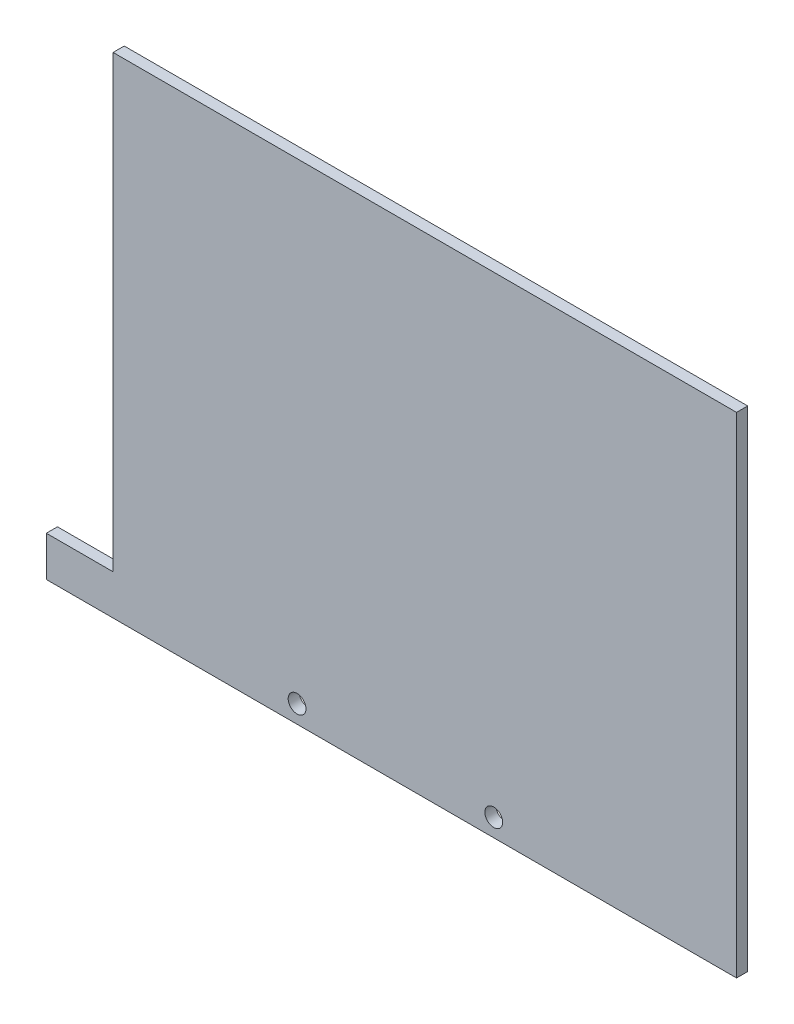
ISO-10303-21;
HEADER;
FILE_DESCRIPTION(('STEP AP214'),'2;1');
FILE_NAME('part.step','',(''),(''),'','','');
FILE_SCHEMA(('AUTOMOTIVE_DESIGN { 1 0 10303 214 1 1 1 1 }'));
ENDSEC;
DATA;
#1=APPLICATION_CONTEXT('core data for automotive mechanical design processes');
#2=APPLICATION_PROTOCOL_DEFINITION('international standard','automotive_design',2000,#1);
#3=PRODUCT_CONTEXT('',#1,'mechanical');
#4=PRODUCT('Part','Part','',(#3));
#5=PRODUCT_RELATED_PRODUCT_CATEGORY('part','',(#4));
#6=PRODUCT_DEFINITION_FORMATION('','',#4);
#7=PRODUCT_DEFINITION_CONTEXT('part definition',#1,'design');
#8=PRODUCT_DEFINITION('design','',#6,#7);
#9=PRODUCT_DEFINITION_SHAPE('','',#8);
#10=(LENGTH_UNIT() NAMED_UNIT(*) SI_UNIT(.MILLI.,.METRE.));
#11=(NAMED_UNIT(*) PLANE_ANGLE_UNIT() SI_UNIT($,.RADIAN.));
#12=(NAMED_UNIT(*) SI_UNIT($,.STERADIAN.) SOLID_ANGLE_UNIT());
#13=UNCERTAINTY_MEASURE_WITH_UNIT(LENGTH_MEASURE(1.E-05),#10,'distance_accuracy_value','');
#14=(GEOMETRIC_REPRESENTATION_CONTEXT(3) GLOBAL_UNCERTAINTY_ASSIGNED_CONTEXT((#13)) GLOBAL_UNIT_ASSIGNED_CONTEXT((#10,
#11,#12)) REPRESENTATION_CONTEXT('',''));
#15=CARTESIAN_POINT('',(0.,0.,0.));
#16=DIRECTION('',(0.,0.,1.));
#17=DIRECTION('',(1.,0.,0.));
#18=AXIS2_PLACEMENT_3D('',#15,#16,#17);
#19=CARTESIAN_POINT('',(0.,-110.,5.));
#20=DIRECTION('',(0.,1.,0.));
#21=DIRECTION('',(-1.,0.,0.));
#22=AXIS2_PLACEMENT_3D('',#19,#20,#21);
#23=PLANE('',#22);
#24=DIRECTION('',(1.,0.,0.));
#25=VECTOR('',#24,1.);
#26=CARTESIAN_POINT('',(0.,-110.,0.));
#27=LINE('',#26,#25);
#28=CARTESIAN_POINT('',(-170.,-110.,0.));
#29=VERTEX_POINT('',#28);
#30=CARTESIAN_POINT('',(140.,-110.,0.));
#31=VERTEX_POINT('',#30);
#32=EDGE_CURVE('E122',#29,#31,#27,.T.);
#33=ORIENTED_EDGE('',*,*,#32,.T.);
#34=DIRECTION('',(0.,0.,-1.));
#35=VECTOR('',#34,1.);
#36=CARTESIAN_POINT('',(140.,-110.,5.));
#37=LINE('',#36,#35);
#38=CARTESIAN_POINT('',(140.,-110.,5.));
#39=VERTEX_POINT('',#38);
#40=EDGE_CURVE('E11',#39,#31,#37,.T.);
#41=ORIENTED_EDGE('',*,*,#40,.F.);
#42=DIRECTION('',(1.,0.,0.));
#43=VECTOR('',#42,1.);
#44=CARTESIAN_POINT('',(0.,-110.,5.));
#45=LINE('',#44,#43);
#46=CARTESIAN_POINT('',(-170.,-110.,5.));
#47=VERTEX_POINT('',#46);
#48=EDGE_CURVE('E136',#47,#39,#45,.T.);
#49=ORIENTED_EDGE('',*,*,#48,.F.);
#50=DIRECTION('',(0.,0.,-1.));
#51=VECTOR('',#50,1.);
#52=CARTESIAN_POINT('',(-170.,-110.,5.));
#53=LINE('',#52,#51);
#54=EDGE_CURVE('E53',#47,#29,#53,.T.);
#55=ORIENTED_EDGE('',*,*,#54,.T.);
#56=EDGE_LOOP('',(#33,#41,#49,#55));
#57=FACE_BOUND('',#56,.T.);
#58=ADVANCED_FACE('F35',(#57),#23,.F.);
#59=CARTESIAN_POINT('',(140.,0.,5.));
#60=DIRECTION('',(-1.,0.,0.));
#61=DIRECTION('',(0.,-1.,0.));
#62=AXIS2_PLACEMENT_3D('',#59,#60,#61);
#63=PLANE('',#62);
#64=DIRECTION('',(0.,1.,0.));
#65=VECTOR('',#64,1.);
#66=CARTESIAN_POINT('',(140.,0.,0.));
#67=LINE('',#66,#65);
#68=CARTESIAN_POINT('',(140.,110.,0.));
#69=VERTEX_POINT('',#68);
#70=EDGE_CURVE('E124',#31,#69,#67,.T.);
#71=ORIENTED_EDGE('',*,*,#70,.T.);
#72=DIRECTION('',(0.,0.,-1.));
#73=VECTOR('',#72,1.);
#74=CARTESIAN_POINT('',(140.,110.,5.));
#75=LINE('',#74,#73);
#76=CARTESIAN_POINT('',(140.,110.,5.));
#77=VERTEX_POINT('',#76);
#78=EDGE_CURVE('E44',#77,#69,#75,.T.);
#79=ORIENTED_EDGE('',*,*,#78,.F.);
#80=DIRECTION('',(0.,1.,0.));
#81=VECTOR('',#80,1.);
#82=CARTESIAN_POINT('',(140.,0.,5.));
#83=LINE('',#82,#81);
#84=EDGE_CURVE('E86',#39,#77,#83,.T.);
#85=ORIENTED_EDGE('',*,*,#84,.F.);
#86=ORIENTED_EDGE('',*,*,#40,.T.);
#87=EDGE_LOOP('',(#71,#79,#85,#86));
#88=FACE_BOUND('',#87,.T.);
#89=ADVANCED_FACE('F155',(#88),#63,.F.);
#90=CARTESIAN_POINT('',(0.,110.,5.));
#91=DIRECTION('',(0.,1.,0.));
#92=DIRECTION('',(-1.,0.,0.));
#93=AXIS2_PLACEMENT_3D('',#90,#91,#92);
#94=PLANE('',#93);
#95=DIRECTION('',(1.,0.,0.));
#96=VECTOR('',#95,1.);
#97=CARTESIAN_POINT('',(0.,110.,0.));
#98=LINE('',#97,#96);
#99=CARTESIAN_POINT('',(-140.,110.,0.));
#100=VERTEX_POINT('',#99);
#101=EDGE_CURVE('E127',#100,#69,#98,.T.);
#102=ORIENTED_EDGE('',*,*,#101,.F.);
#103=DIRECTION('',(0.,0.,-1.));
#104=VECTOR('',#103,1.);
#105=CARTESIAN_POINT('',(-140.,110.,5.));
#106=LINE('',#105,#104);
#107=CARTESIAN_POINT('',(-140.,110.,5.));
#108=VERTEX_POINT('',#107);
#109=EDGE_CURVE('E105',#108,#100,#106,.T.);
#110=ORIENTED_EDGE('',*,*,#109,.F.);
#111=DIRECTION('',(1.,0.,0.));
#112=VECTOR('',#111,1.);
#113=CARTESIAN_POINT('',(0.,110.,5.));
#114=LINE('',#113,#112);
#115=EDGE_CURVE('E116',#108,#77,#114,.T.);
#116=ORIENTED_EDGE('',*,*,#115,.T.);
#117=ORIENTED_EDGE('',*,*,#78,.T.);
#118=EDGE_LOOP('',(#102,#110,#116,#117));
#119=FACE_BOUND('',#118,.T.);
#120=ADVANCED_FACE('F158',(#119),#94,.T.);
#121=CARTESIAN_POINT('',(-140.,0.,5.));
#122=DIRECTION('',(-1.,0.,0.));
#123=DIRECTION('',(0.,-1.,0.));
#124=AXIS2_PLACEMENT_3D('',#121,#122,#123);
#125=PLANE('',#124);
#126=DIRECTION('',(0.,1.,0.));
#127=VECTOR('',#126,1.);
#128=CARTESIAN_POINT('',(-140.,0.,0.));
#129=LINE('',#128,#127);
#130=CARTESIAN_POINT('',(-140.,-92.0000000000001,0.));
#131=VERTEX_POINT('',#130);
#132=EDGE_CURVE('E102',#131,#100,#129,.T.);
#133=ORIENTED_EDGE('',*,*,#132,.F.);
#134=DIRECTION('',(0.,0.,-1.));
#135=VECTOR('',#134,1.);
#136=CARTESIAN_POINT('',(-140.,-92.0000000000001,5.));
#137=LINE('',#136,#135);
#138=CARTESIAN_POINT('',(-140.,-92.0000000000001,5.));
#139=VERTEX_POINT('',#138);
#140=EDGE_CURVE('E96',#139,#131,#137,.T.);
#141=ORIENTED_EDGE('',*,*,#140,.F.);
#142=DIRECTION('',(0.,1.,0.));
#143=VECTOR('',#142,1.);
#144=CARTESIAN_POINT('',(-140.,0.,5.));
#145=LINE('',#144,#143);
#146=EDGE_CURVE('E100',#139,#108,#145,.T.);
#147=ORIENTED_EDGE('',*,*,#146,.T.);
#148=ORIENTED_EDGE('',*,*,#109,.T.);
#149=EDGE_LOOP('',(#133,#141,#147,#148));
#150=FACE_BOUND('',#149,.T.);
#151=ADVANCED_FACE('F98',(#150),#125,.T.);
#152=CARTESIAN_POINT('',(0.,-92.0000000000001,5.));
#153=DIRECTION('',(0.,-1.,0.));
#154=DIRECTION('',(0.,0.,-1.));
#155=AXIS2_PLACEMENT_3D('',#152,#153,#154);
#156=PLANE('',#155);
#157=DIRECTION('',(-1.,0.,0.));
#158=VECTOR('',#157,1.);
#159=CARTESIAN_POINT('',(0.,-92.0000000000001,0.));
#160=LINE('',#159,#158);
#161=CARTESIAN_POINT('',(-170.,-92.0000000000001,0.));
#162=VERTEX_POINT('',#161);
#163=EDGE_CURVE('E131',#131,#162,#160,.T.);
#164=ORIENTED_EDGE('',*,*,#163,.T.);
#165=DIRECTION('',(0.,0.,-1.));
#166=VECTOR('',#165,1.);
#167=CARTESIAN_POINT('',(-170.,-92.0000000000001,5.));
#168=LINE('',#167,#166);
#169=CARTESIAN_POINT('',(-170.,-92.0000000000001,5.));
#170=VERTEX_POINT('',#169);
#171=EDGE_CURVE('E74',#170,#162,#168,.T.);
#172=ORIENTED_EDGE('',*,*,#171,.F.);
#173=DIRECTION('',(-1.,0.,0.));
#174=VECTOR('',#173,1.);
#175=CARTESIAN_POINT('',(0.,-92.0000000000001,5.));
#176=LINE('',#175,#174);
#177=EDGE_CURVE('E107',#139,#170,#176,.T.);
#178=ORIENTED_EDGE('',*,*,#177,.F.);
#179=ORIENTED_EDGE('',*,*,#140,.T.);
#180=EDGE_LOOP('',(#164,#172,#178,#179));
#181=FACE_BOUND('',#180,.T.);
#182=ADVANCED_FACE('F108',(#181),#156,.F.);
#183=CARTESIAN_POINT('',(-170.,0.,5.));
#184=DIRECTION('',(-1.,0.,0.));
#185=DIRECTION('',(0.,0.,1.));
#186=AXIS2_PLACEMENT_3D('',#183,#184,#185);
#187=PLANE('',#186);
#188=DIRECTION('',(0.,1.,0.));
#189=VECTOR('',#188,1.);
#190=CARTESIAN_POINT('',(-170.,0.,0.));
#191=LINE('',#190,#189);
#192=EDGE_CURVE('E133',#29,#162,#191,.T.);
#193=ORIENTED_EDGE('',*,*,#192,.F.);
#194=ORIENTED_EDGE('',*,*,#54,.F.);
#195=DIRECTION('',(0.,1.,0.));
#196=VECTOR('',#195,1.);
#197=CARTESIAN_POINT('',(-170.,0.,5.));
#198=LINE('',#197,#196);
#199=EDGE_CURVE('E111',#47,#170,#198,.T.);
#200=ORIENTED_EDGE('',*,*,#199,.T.);
#201=ORIENTED_EDGE('',*,*,#171,.T.);
#202=EDGE_LOOP('',(#193,#194,#200,#201));
#203=FACE_BOUND('',#202,.T.);
#204=ADVANCED_FACE('F161',(#203),#187,.T.);
#205=CARTESIAN_POINT('',(0.,0.,5.));
#206=DIRECTION('',(0.,0.,1.));
#207=DIRECTION('',(1.,0.,0.));
#208=AXIS2_PLACEMENT_3D('',#205,#206,#207);
#209=PLANE('',#208);
#210=CARTESIAN_POINT('',(-57.3771170838313,-102.,5.));
#211=DIRECTION('',(0.,0.,1.));
#212=DIRECTION('',(1.,0.,0.));
#213=AXIS2_PLACEMENT_3D('',#210,#211,#212);
#214=CIRCLE('',#213,4.00000000000001);
#215=CARTESIAN_POINT('',(-53.3771170838313,-102.,5.));
#216=VERTEX_POINT('',#215);
#217=EDGE_CURVE('E142',#216,#216,#214,.T.);
#218=ORIENTED_EDGE('',*,*,#217,.F.);
#219=EDGE_LOOP('',(#218));
#220=FACE_BOUND('',#219,.T.);
#221=CARTESIAN_POINT('',(30.9504916949953,-102.,5.));
#222=DIRECTION('',(0.,0.,1.));
#223=DIRECTION('',(1.,0.,0.));
#224=AXIS2_PLACEMENT_3D('',#221,#222,#223);
#225=CIRCLE('',#224,4.00000000000001);
#226=CARTESIAN_POINT('',(34.9504916949953,-102.,5.));
#227=VERTEX_POINT('',#226);
#228=EDGE_CURVE('E147',#227,#227,#225,.T.);
#229=ORIENTED_EDGE('',*,*,#228,.F.);
#230=EDGE_LOOP('',(#229));
#231=FACE_BOUND('',#230,.T.);
#232=ORIENTED_EDGE('',*,*,#48,.T.);
#233=ORIENTED_EDGE('',*,*,#84,.T.);
#234=ORIENTED_EDGE('',*,*,#115,.F.);
#235=ORIENTED_EDGE('',*,*,#146,.F.);
#236=ORIENTED_EDGE('',*,*,#177,.T.);
#237=ORIENTED_EDGE('',*,*,#199,.F.);
#238=EDGE_LOOP('',(#232,#233,#234,#235,#236,#237));
#239=FACE_BOUND('',#238,.T.);
#240=ADVANCED_FACE('F114',(#220,#231,#239),#209,.T.);
#241=CARTESIAN_POINT('',(0.,0.,0.));
#242=DIRECTION('',(0.,0.,1.));
#243=DIRECTION('',(1.,0.,0.));
#244=AXIS2_PLACEMENT_3D('',#241,#242,#243);
#245=PLANE('',#244);
#246=CARTESIAN_POINT('',(-57.3771170838313,-102.,0.));
#247=DIRECTION('',(0.,0.,1.));
#248=DIRECTION('',(1.,0.,0.));
#249=AXIS2_PLACEMENT_3D('',#246,#247,#248);
#250=CIRCLE('',#249,4.00000000000001);
#251=CARTESIAN_POINT('',(-53.3771170838313,-102.,0.));
#252=VERTEX_POINT('',#251);
#253=EDGE_CURVE('E38',#252,#252,#250,.T.);
#254=ORIENTED_EDGE('',*,*,#253,.T.);
#255=EDGE_LOOP('',(#254));
#256=FACE_BOUND('',#255,.T.);
#257=CARTESIAN_POINT('',(30.9504916949953,-102.,0.));
#258=DIRECTION('',(0.,0.,1.));
#259=DIRECTION('',(1.,0.,0.));
#260=AXIS2_PLACEMENT_3D('',#257,#258,#259);
#261=CIRCLE('',#260,4.00000000000001);
#262=CARTESIAN_POINT('',(34.9504916949953,-102.,0.));
#263=VERTEX_POINT('',#262);
#264=EDGE_CURVE('E140',#263,#263,#261,.T.);
#265=ORIENTED_EDGE('',*,*,#264,.T.);
#266=EDGE_LOOP('',(#265));
#267=FACE_BOUND('',#266,.T.);
#268=ORIENTED_EDGE('',*,*,#32,.F.);
#269=ORIENTED_EDGE('',*,*,#192,.T.);
#270=ORIENTED_EDGE('',*,*,#163,.F.);
#271=ORIENTED_EDGE('',*,*,#132,.T.);
#272=ORIENTED_EDGE('',*,*,#101,.T.);
#273=ORIENTED_EDGE('',*,*,#70,.F.);
#274=EDGE_LOOP('',(#268,#269,#270,#271,#272,#273));
#275=FACE_BOUND('',#274,.T.);
#276=ADVANCED_FACE('F160',(#256,#267,#275),#245,.F.);
#277=CARTESIAN_POINT('',(30.9504916949953,-102.,-5.));
#278=DIRECTION('',(0.,0.,1.));
#279=DIRECTION('',(1.,0.,0.));
#280=AXIS2_PLACEMENT_3D('',#277,#278,#279);
#281=CYLINDRICAL_SURFACE('',#280,4.00000000000001);
#282=ORIENTED_EDGE('',*,*,#228,.T.);
#283=EDGE_LOOP('',(#282));
#284=FACE_BOUND('',#283,.T.);
#285=ORIENTED_EDGE('',*,*,#264,.F.);
#286=EDGE_LOOP('',(#285));
#287=FACE_BOUND('',#286,.T.);
#288=ADVANCED_FACE('F211',(#284,#287),#281,.F.);
#289=CARTESIAN_POINT('',(-57.3771170838313,-102.,-5.));
#290=DIRECTION('',(0.,0.,1.));
#291=DIRECTION('',(1.,0.,0.));
#292=AXIS2_PLACEMENT_3D('',#289,#290,#291);
#293=CYLINDRICAL_SURFACE('',#292,4.00000000000001);
#294=ORIENTED_EDGE('',*,*,#217,.T.);
#295=EDGE_LOOP('',(#294));
#296=FACE_BOUND('',#295,.T.);
#297=ORIENTED_EDGE('',*,*,#253,.F.);
#298=EDGE_LOOP('',(#297));
#299=FACE_BOUND('',#298,.T.);
#300=ADVANCED_FACE('F220',(#296,#299),#293,.F.);
#301=CLOSED_SHELL('',(#58,#89,#120,#151,#182,#204,#240,#276,#288,#300));
#302=MANIFOLD_SOLID_BREP('B2',#301);
#303=ADVANCED_BREP_SHAPE_REPRESENTATION('',(#18,#302),#14);
#304=SHAPE_DEFINITION_REPRESENTATION(#9,#303);
ENDSEC;
END-ISO-10303-21;
